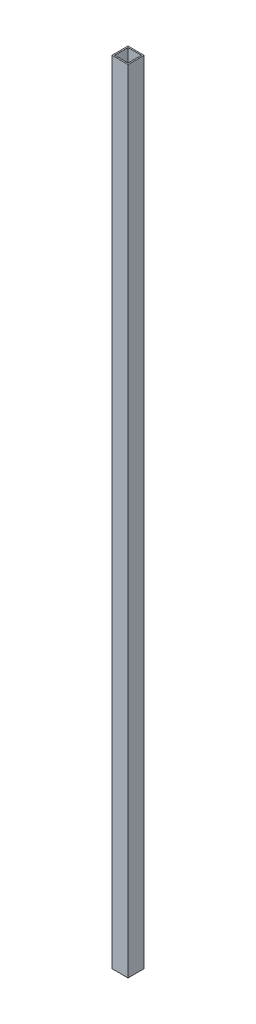
ISO-10303-21;
HEADER;
FILE_DESCRIPTION(('STEP AP214'),'2;1');
FILE_NAME('part.step','',(''),(''),'','','');
FILE_SCHEMA(('AUTOMOTIVE_DESIGN { 1 0 10303 214 1 1 1 1 }'));
ENDSEC;
DATA;
#1=APPLICATION_CONTEXT('core data for automotive mechanical design processes');
#2=APPLICATION_PROTOCOL_DEFINITION('international standard','automotive_design',2000,#1);
#3=PRODUCT_CONTEXT('',#1,'mechanical');
#4=PRODUCT('Part','Part','',(#3));
#5=PRODUCT_RELATED_PRODUCT_CATEGORY('part','',(#4));
#6=PRODUCT_DEFINITION_FORMATION('','',#4);
#7=PRODUCT_DEFINITION_CONTEXT('part definition',#1,'design');
#8=PRODUCT_DEFINITION('design','',#6,#7);
#9=PRODUCT_DEFINITION_SHAPE('','',#8);
#10=(LENGTH_UNIT() NAMED_UNIT(*) SI_UNIT(.MILLI.,.METRE.));
#11=(NAMED_UNIT(*) PLANE_ANGLE_UNIT() SI_UNIT($,.RADIAN.));
#12=(NAMED_UNIT(*) SI_UNIT($,.STERADIAN.) SOLID_ANGLE_UNIT());
#13=UNCERTAINTY_MEASURE_WITH_UNIT(LENGTH_MEASURE(1.E-05),#10,'distance_accuracy_value','');
#14=(GEOMETRIC_REPRESENTATION_CONTEXT(3) GLOBAL_UNCERTAINTY_ASSIGNED_CONTEXT((#13)) GLOBAL_UNIT_ASSIGNED_CONTEXT((#10,
#11,#12)) REPRESENTATION_CONTEXT('',''));
#15=CARTESIAN_POINT('',(0.,0.,0.));
#16=DIRECTION('',(0.,0.,1.));
#17=DIRECTION('',(1.,0.,0.));
#18=AXIS2_PLACEMENT_3D('',#15,#16,#17);
#19=CARTESIAN_POINT('',(0.,939.8,0.));
#20=DIRECTION('',(0.,-1.,0.));
#21=DIRECTION('',(0.,0.,-1.));
#22=AXIS2_PLACEMENT_3D('',#19,#20,#21);
#23=PLANE('',#22);
#24=DIRECTION('',(0.,0.,1.));
#25=VECTOR('',#24,1.);
#26=CARTESIAN_POINT('',(0.,939.8,0.));
#27=LINE('',#26,#25);
#28=CARTESIAN_POINT('',(0.,939.8,-19.05));
#29=VERTEX_POINT('',#28);
#30=CARTESIAN_POINT('',(0.,939.8,0.));
#31=VERTEX_POINT('',#30);
#32=EDGE_CURVE('E170',#29,#31,#27,.T.);
#33=ORIENTED_EDGE('',*,*,#32,.T.);
#34=DIRECTION('',(1.,0.,0.));
#35=VECTOR('',#34,1.);
#36=CARTESIAN_POINT('',(0.,939.8,0.));
#37=LINE('',#36,#35);
#38=CARTESIAN_POINT('',(19.05,939.8,0.));
#39=VERTEX_POINT('',#38);
#40=EDGE_CURVE('E174',#31,#39,#37,.T.);
#41=ORIENTED_EDGE('',*,*,#40,.T.);
#42=DIRECTION('',(0.,0.,-1.));
#43=VECTOR('',#42,1.);
#44=CARTESIAN_POINT('',(19.05,939.8,0.));
#45=LINE('',#44,#43);
#46=CARTESIAN_POINT('',(19.05,939.8,-19.05));
#47=VERTEX_POINT('',#46);
#48=EDGE_CURVE('E178',#39,#47,#45,.T.);
#49=ORIENTED_EDGE('',*,*,#48,.T.);
#50=DIRECTION('',(-1.,0.,0.));
#51=VECTOR('',#50,1.);
#52=CARTESIAN_POINT('',(0.,939.8,-19.05));
#53=LINE('',#52,#51);
#54=EDGE_CURVE('E181',#47,#29,#53,.T.);
#55=ORIENTED_EDGE('',*,*,#54,.T.);
#56=EDGE_LOOP('',(#33,#41,#49,#55));
#57=FACE_BOUND('',#56,.T.);
#58=DIRECTION('',(0.,0.,-1.));
#59=VECTOR('',#58,1.);
#60=CARTESIAN_POINT('',(17.4625,939.8,-1.5875));
#61=LINE('',#60,#59);
#62=CARTESIAN_POINT('',(17.4625,939.8,-1.5875));
#63=VERTEX_POINT('',#62);
#64=CARTESIAN_POINT('',(17.4625,939.8,-17.4625));
#65=VERTEX_POINT('',#64);
#66=EDGE_CURVE('E121',#63,#65,#61,.T.);
#67=ORIENTED_EDGE('',*,*,#66,.F.);
#68=DIRECTION('',(1.,0.,0.));
#69=VECTOR('',#68,1.);
#70=CARTESIAN_POINT('',(1.5875,939.8,-1.5875));
#71=LINE('',#70,#69);
#72=CARTESIAN_POINT('',(1.5875,939.8,-1.5875));
#73=VERTEX_POINT('',#72);
#74=EDGE_CURVE('E148',#73,#63,#71,.T.);
#75=ORIENTED_EDGE('',*,*,#74,.F.);
#76=DIRECTION('',(0.,0.,1.));
#77=VECTOR('',#76,1.);
#78=CARTESIAN_POINT('',(1.5875,939.8,-1.5875));
#79=LINE('',#78,#77);
#80=CARTESIAN_POINT('',(1.5875,939.8,-17.4625));
#81=VERTEX_POINT('',#80);
#82=EDGE_CURVE('E143',#81,#73,#79,.T.);
#83=ORIENTED_EDGE('',*,*,#82,.F.);
#84=DIRECTION('',(-1.,0.,0.));
#85=VECTOR('',#84,1.);
#86=CARTESIAN_POINT('',(1.5875,939.8,-17.4625));
#87=LINE('',#86,#85);
#88=EDGE_CURVE('E130',#65,#81,#87,.T.);
#89=ORIENTED_EDGE('',*,*,#88,.F.);
#90=EDGE_LOOP('',(#67,#75,#83,#89));
#91=FACE_BOUND('',#90,.T.);
#92=ADVANCED_FACE('F39',(#57,#91),#23,.F.);
#93=CARTESIAN_POINT('',(0.,0.,0.));
#94=DIRECTION('',(0.,-1.,0.));
#95=DIRECTION('',(0.,0.,-1.));
#96=AXIS2_PLACEMENT_3D('',#93,#94,#95);
#97=PLANE('',#96);
#98=DIRECTION('',(0.,0.,1.));
#99=VECTOR('',#98,1.);
#100=CARTESIAN_POINT('',(0.,0.,0.));
#101=LINE('',#100,#99);
#102=CARTESIAN_POINT('',(0.,0.,-19.05));
#103=VERTEX_POINT('',#102);
#104=CARTESIAN_POINT('',(0.,0.,0.));
#105=VERTEX_POINT('',#104);
#106=EDGE_CURVE('E139',#103,#105,#101,.T.);
#107=ORIENTED_EDGE('',*,*,#106,.F.);
#108=DIRECTION('',(-1.,0.,0.));
#109=VECTOR('',#108,1.);
#110=CARTESIAN_POINT('',(0.,0.,-19.05));
#111=LINE('',#110,#109);
#112=CARTESIAN_POINT('',(19.05,0.,-19.05));
#113=VERTEX_POINT('',#112);
#114=EDGE_CURVE('E175',#113,#103,#111,.T.);
#115=ORIENTED_EDGE('',*,*,#114,.F.);
#116=DIRECTION('',(0.,0.,-1.));
#117=VECTOR('',#116,1.);
#118=CARTESIAN_POINT('',(19.05,0.,0.));
#119=LINE('',#118,#117);
#120=CARTESIAN_POINT('',(19.05,0.,0.));
#121=VERTEX_POINT('',#120);
#122=EDGE_CURVE('E190',#121,#113,#119,.T.);
#123=ORIENTED_EDGE('',*,*,#122,.F.);
#124=DIRECTION('',(1.,0.,0.));
#125=VECTOR('',#124,1.);
#126=CARTESIAN_POINT('',(0.,0.,0.));
#127=LINE('',#126,#125);
#128=EDGE_CURVE('E187',#105,#121,#127,.T.);
#129=ORIENTED_EDGE('',*,*,#128,.F.);
#130=EDGE_LOOP('',(#107,#115,#123,#129));
#131=FACE_BOUND('',#130,.T.);
#132=DIRECTION('',(1.,0.,0.));
#133=VECTOR('',#132,1.);
#134=CARTESIAN_POINT('',(1.5875,0.,-1.5875));
#135=LINE('',#134,#133);
#136=CARTESIAN_POINT('',(1.5875,0.,-1.5875));
#137=VERTEX_POINT('',#136);
#138=CARTESIAN_POINT('',(17.4625,0.,-1.5875));
#139=VERTEX_POINT('',#138);
#140=EDGE_CURVE('E131',#137,#139,#135,.T.);
#141=ORIENTED_EDGE('',*,*,#140,.T.);
#142=DIRECTION('',(0.,0.,-1.));
#143=VECTOR('',#142,1.);
#144=CARTESIAN_POINT('',(17.4625,0.,-1.5875));
#145=LINE('',#144,#143);
#146=CARTESIAN_POINT('',(17.4625,0.,-17.4625));
#147=VERTEX_POINT('',#146);
#148=EDGE_CURVE('E69',#139,#147,#145,.T.);
#149=ORIENTED_EDGE('',*,*,#148,.T.);
#150=DIRECTION('',(-1.,0.,0.));
#151=VECTOR('',#150,1.);
#152=CARTESIAN_POINT('',(1.5875,0.,-17.4625));
#153=LINE('',#152,#151);
#154=CARTESIAN_POINT('',(1.5875,0.,-17.4625));
#155=VERTEX_POINT('',#154);
#156=EDGE_CURVE('E137',#147,#155,#153,.T.);
#157=ORIENTED_EDGE('',*,*,#156,.T.);
#158=DIRECTION('',(0.,0.,1.));
#159=VECTOR('',#158,1.);
#160=CARTESIAN_POINT('',(1.5875,0.,-1.5875));
#161=LINE('',#160,#159);
#162=EDGE_CURVE('E157',#155,#137,#161,.T.);
#163=ORIENTED_EDGE('',*,*,#162,.T.);
#164=EDGE_LOOP('',(#141,#149,#157,#163));
#165=FACE_BOUND('',#164,.T.);
#166=ADVANCED_FACE('F213',(#131,#165),#97,.T.);
#167=CARTESIAN_POINT('',(0.,939.8,0.));
#168=DIRECTION('',(1.,0.,0.));
#169=DIRECTION('',(0.,0.,-1.));
#170=AXIS2_PLACEMENT_3D('',#167,#168,#169);
#171=PLANE('',#170);
#172=ORIENTED_EDGE('',*,*,#106,.T.);
#173=DIRECTION('',(0.,-1.,0.));
#174=VECTOR('',#173,1.);
#175=CARTESIAN_POINT('',(0.,939.8,0.));
#176=LINE('',#175,#174);
#177=EDGE_CURVE('E11',#31,#105,#176,.T.);
#178=ORIENTED_EDGE('',*,*,#177,.F.);
#179=ORIENTED_EDGE('',*,*,#32,.F.);
#180=DIRECTION('',(0.,-1.,0.));
#181=VECTOR('',#180,1.);
#182=CARTESIAN_POINT('',(0.,939.8,-19.05));
#183=LINE('',#182,#181);
#184=EDGE_CURVE('E183',#29,#103,#183,.T.);
#185=ORIENTED_EDGE('',*,*,#184,.T.);
#186=EDGE_LOOP('',(#172,#178,#179,#185));
#187=FACE_BOUND('',#186,.T.);
#188=ADVANCED_FACE('F41',(#187),#171,.F.);
#189=CARTESIAN_POINT('',(0.,939.8,0.));
#190=DIRECTION('',(0.,0.,-1.));
#191=DIRECTION('',(-1.,0.,0.));
#192=AXIS2_PLACEMENT_3D('',#189,#190,#191);
#193=PLANE('',#192);
#194=ORIENTED_EDGE('',*,*,#128,.T.);
#195=DIRECTION('',(0.,-1.,0.));
#196=VECTOR('',#195,1.);
#197=CARTESIAN_POINT('',(19.05,939.8,0.));
#198=LINE('',#197,#196);
#199=EDGE_CURVE('E48',#39,#121,#198,.T.);
#200=ORIENTED_EDGE('',*,*,#199,.F.);
#201=ORIENTED_EDGE('',*,*,#40,.F.);
#202=ORIENTED_EDGE('',*,*,#177,.T.);
#203=EDGE_LOOP('',(#194,#200,#201,#202));
#204=FACE_BOUND('',#203,.T.);
#205=ADVANCED_FACE('F223',(#204),#193,.F.);
#206=CARTESIAN_POINT('',(19.05,939.8,0.));
#207=DIRECTION('',(-1.,0.,0.));
#208=DIRECTION('',(0.,0.,1.));
#209=AXIS2_PLACEMENT_3D('',#206,#207,#208);
#210=PLANE('',#209);
#211=ORIENTED_EDGE('',*,*,#122,.T.);
#212=DIRECTION('',(0.,-1.,0.));
#213=VECTOR('',#212,1.);
#214=CARTESIAN_POINT('',(19.05,939.8,-19.05));
#215=LINE('',#214,#213);
#216=EDGE_CURVE('E198',#47,#113,#215,.T.);
#217=ORIENTED_EDGE('',*,*,#216,.F.);
#218=ORIENTED_EDGE('',*,*,#48,.F.);
#219=ORIENTED_EDGE('',*,*,#199,.T.);
#220=EDGE_LOOP('',(#211,#217,#218,#219));
#221=FACE_BOUND('',#220,.T.);
#222=ADVANCED_FACE('F207',(#221),#210,.F.);
#223=CARTESIAN_POINT('',(0.,939.8,-19.05));
#224=DIRECTION('',(0.,0.,1.));
#225=DIRECTION('',(1.,0.,0.));
#226=AXIS2_PLACEMENT_3D('',#223,#224,#225);
#227=PLANE('',#226);
#228=ORIENTED_EDGE('',*,*,#114,.T.);
#229=ORIENTED_EDGE('',*,*,#184,.F.);
#230=ORIENTED_EDGE('',*,*,#54,.F.);
#231=ORIENTED_EDGE('',*,*,#216,.T.);
#232=EDGE_LOOP('',(#228,#229,#230,#231));
#233=FACE_BOUND('',#232,.T.);
#234=ADVANCED_FACE('F217',(#233),#227,.F.);
#235=CARTESIAN_POINT('',(17.4625,939.8,-1.5875));
#236=DIRECTION('',(-1.,0.,0.));
#237=DIRECTION('',(0.,0.,1.));
#238=AXIS2_PLACEMENT_3D('',#235,#236,#237);
#239=PLANE('',#238);
#240=ORIENTED_EDGE('',*,*,#148,.F.);
#241=DIRECTION('',(0.,-1.,0.));
#242=VECTOR('',#241,1.);
#243=CARTESIAN_POINT('',(17.4625,939.8,-1.5875));
#244=LINE('',#243,#242);
#245=EDGE_CURVE('E125',#63,#139,#244,.T.);
#246=ORIENTED_EDGE('',*,*,#245,.F.);
#247=ORIENTED_EDGE('',*,*,#66,.T.);
#248=DIRECTION('',(0.,-1.,0.));
#249=VECTOR('',#248,1.);
#250=CARTESIAN_POINT('',(17.4625,939.8,-17.4625));
#251=LINE('',#250,#249);
#252=EDGE_CURVE('E124',#65,#147,#251,.T.);
#253=ORIENTED_EDGE('',*,*,#252,.T.);
#254=EDGE_LOOP('',(#240,#246,#247,#253));
#255=FACE_BOUND('',#254,.T.);
#256=ADVANCED_FACE('F123',(#255),#239,.T.);
#257=CARTESIAN_POINT('',(1.5875,939.8,-17.4625));
#258=DIRECTION('',(0.,0.,1.));
#259=DIRECTION('',(1.,0.,0.));
#260=AXIS2_PLACEMENT_3D('',#257,#258,#259);
#261=PLANE('',#260);
#262=ORIENTED_EDGE('',*,*,#156,.F.);
#263=ORIENTED_EDGE('',*,*,#252,.F.);
#264=ORIENTED_EDGE('',*,*,#88,.T.);
#265=DIRECTION('',(0.,-1.,0.));
#266=VECTOR('',#265,1.);
#267=CARTESIAN_POINT('',(1.5875,939.8,-17.4625));
#268=LINE('',#267,#266);
#269=EDGE_CURVE('E140',#81,#155,#268,.T.);
#270=ORIENTED_EDGE('',*,*,#269,.T.);
#271=EDGE_LOOP('',(#262,#263,#264,#270));
#272=FACE_BOUND('',#271,.T.);
#273=ADVANCED_FACE('F134',(#272),#261,.T.);
#274=CARTESIAN_POINT('',(1.5875,939.8,-1.5875));
#275=DIRECTION('',(1.,0.,0.));
#276=DIRECTION('',(0.,0.,-1.));
#277=AXIS2_PLACEMENT_3D('',#274,#275,#276);
#278=PLANE('',#277);
#279=ORIENTED_EDGE('',*,*,#162,.F.);
#280=ORIENTED_EDGE('',*,*,#269,.F.);
#281=ORIENTED_EDGE('',*,*,#82,.T.);
#282=DIRECTION('',(0.,-1.,0.));
#283=VECTOR('',#282,1.);
#284=CARTESIAN_POINT('',(1.5875,939.8,-1.5875));
#285=LINE('',#284,#283);
#286=EDGE_CURVE('E58',#73,#137,#285,.T.);
#287=ORIENTED_EDGE('',*,*,#286,.T.);
#288=EDGE_LOOP('',(#279,#280,#281,#287));
#289=FACE_BOUND('',#288,.T.);
#290=ADVANCED_FACE('F246',(#289),#278,.T.);
#291=CARTESIAN_POINT('',(1.5875,939.8,-1.5875));
#292=DIRECTION('',(0.,0.,-1.));
#293=DIRECTION('',(-1.,0.,0.));
#294=AXIS2_PLACEMENT_3D('',#291,#292,#293);
#295=PLANE('',#294);
#296=ORIENTED_EDGE('',*,*,#140,.F.);
#297=ORIENTED_EDGE('',*,*,#286,.F.);
#298=ORIENTED_EDGE('',*,*,#74,.T.);
#299=ORIENTED_EDGE('',*,*,#245,.T.);
#300=EDGE_LOOP('',(#296,#297,#298,#299));
#301=FACE_BOUND('',#300,.T.);
#302=ADVANCED_FACE('F250',(#301),#295,.T.);
#303=CLOSED_SHELL('',(#92,#166,#188,#205,#222,#234,#256,#273,#290,#302));
#304=MANIFOLD_SOLID_BREP('B2',#303);
#305=ADVANCED_BREP_SHAPE_REPRESENTATION('',(#18,#304),#14);
#306=SHAPE_DEFINITION_REPRESENTATION(#9,#305);
ENDSEC;
END-ISO-10303-21;
